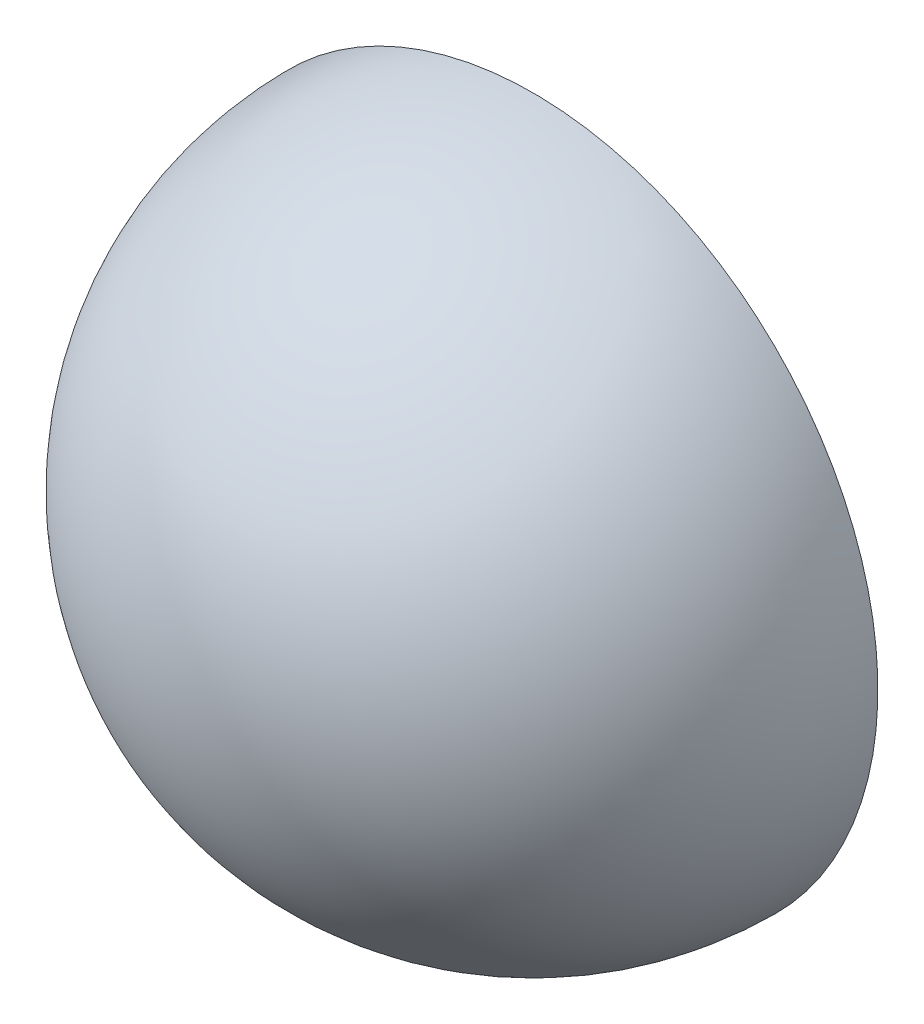
ISO-10303-21;
HEADER;
FILE_DESCRIPTION(('STEP AP214'),'2;1');
FILE_NAME('part.step','',(''),(''),'','','');
FILE_SCHEMA(('AUTOMOTIVE_DESIGN { 1 0 10303 214 1 1 1 1 }'));
ENDSEC;
DATA;
#1=APPLICATION_CONTEXT('core data for automotive mechanical design processes');
#2=APPLICATION_PROTOCOL_DEFINITION('international standard','automotive_design',2000,#1);
#3=PRODUCT_CONTEXT('',#1,'mechanical');
#4=PRODUCT('Part','Part','',(#3));
#5=PRODUCT_RELATED_PRODUCT_CATEGORY('part','',(#4));
#6=PRODUCT_DEFINITION_FORMATION('','',#4);
#7=PRODUCT_DEFINITION_CONTEXT('part definition',#1,'design');
#8=PRODUCT_DEFINITION('design','',#6,#7);
#9=PRODUCT_DEFINITION_SHAPE('','',#8);
#10=(LENGTH_UNIT() NAMED_UNIT(*) SI_UNIT(.MILLI.,.METRE.));
#11=(NAMED_UNIT(*) PLANE_ANGLE_UNIT() SI_UNIT($,.RADIAN.));
#12=(NAMED_UNIT(*) SI_UNIT($,.STERADIAN.) SOLID_ANGLE_UNIT());
#13=UNCERTAINTY_MEASURE_WITH_UNIT(LENGTH_MEASURE(1.E-05),#10,'distance_accuracy_value','');
#14=(GEOMETRIC_REPRESENTATION_CONTEXT(3) GLOBAL_UNCERTAINTY_ASSIGNED_CONTEXT((#13)) GLOBAL_UNIT_ASSIGNED_CONTEXT((#10,
#11,#12)) REPRESENTATION_CONTEXT('',''));
#15=CARTESIAN_POINT('',(0.,0.,0.));
#16=DIRECTION('',(0.,0.,1.));
#17=DIRECTION('',(1.,0.,0.));
#18=AXIS2_PLACEMENT_3D('',#15,#16,#17);
#19=CARTESIAN_POINT('',(0.,0.,0.));
#20=DIRECTION('',(0.,1.,0.));
#21=DIRECTION('',(-1.,0.,0.));
#22=AXIS2_PLACEMENT_3D('',#19,#20,#21);
#23=SPHERICAL_SURFACE('',#22,2.5);
#24=CARTESIAN_POINT('',(0.,0.,0.));
#25=DIRECTION('',(0.,0.,-1.));
#26=DIRECTION('',(-1.,0.,0.));
#27=AXIS2_PLACEMENT_3D('',#24,#25,#26);
#28=SPHERICAL_SURFACE('',#27,2.5);
#29=CARTESIAN_POINT('',(0.,0.,0.));
#30=DIRECTION('',(0.,0.,-1.));
#31=DIRECTION('',(-1.,0.,0.));
#32=AXIS2_PLACEMENT_3D('',#29,#30,#31);
#33=CIRCLE('',#32,2.5);
#34=CARTESIAN_POINT('',(-2.5,0.,0.));
#35=VERTEX_POINT('',#34);
#36=EDGE_CURVE('E10',#35,#35,#33,.T.);
#37=ORIENTED_EDGE('',*,*,#36,.F.);
#38=EDGE_LOOP('',(#37));
#39=FACE_BOUND('',#38,.T.);
#40=ADVANCED_FACE('F34',(#39),#28,.T.);
#41=CARTESIAN_POINT('',(0.,0.,0.));
#42=DIRECTION('',(0.,0.,-1.));
#43=DIRECTION('',(-1.,0.,0.));
#44=AXIS2_PLACEMENT_3D('',#41,#42,#43);
#45=PLANE('',#44);
#46=ORIENTED_EDGE('',*,*,#36,.T.);
#47=EDGE_LOOP('',(#46));
#48=FACE_BOUND('',#47,.T.);
#49=ADVANCED_FACE('F41',(#48),#45,.T.);
#50=CLOSED_SHELL('',(#40,#49));
#51=MANIFOLD_SOLID_BREP('B2',#50);
#52=ADVANCED_BREP_SHAPE_REPRESENTATION('',(#18,#51),#14);
#53=SHAPE_DEFINITION_REPRESENTATION(#9,#52);
ENDSEC;
END-ISO-10303-21;
